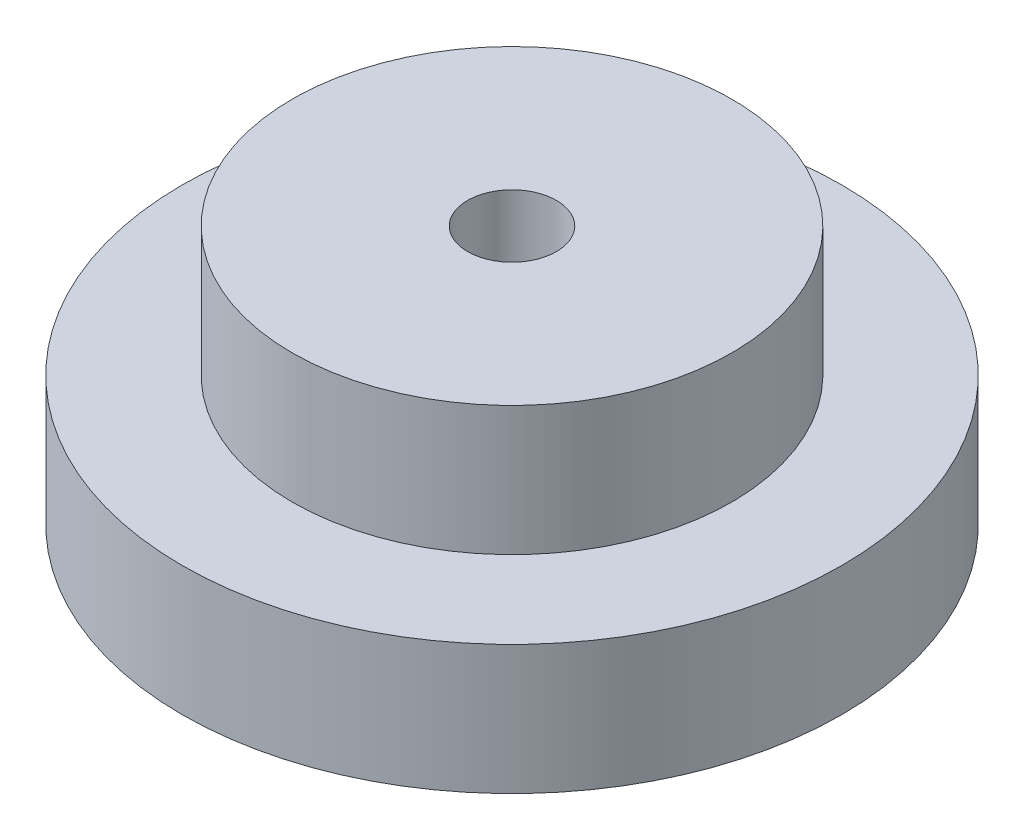
ISO-10303-21;
HEADER;
FILE_DESCRIPTION(('STEP AP214'),'2;1');
FILE_NAME('part.step','',(''),(''),'','','');
FILE_SCHEMA(('AUTOMOTIVE_DESIGN { 1 0 10303 214 1 1 1 1 }'));
ENDSEC;
DATA;
#1=APPLICATION_CONTEXT('core data for automotive mechanical design processes');
#2=APPLICATION_PROTOCOL_DEFINITION('international standard','automotive_design',2000,#1);
#3=PRODUCT_CONTEXT('',#1,'mechanical');
#4=PRODUCT('Part','Part','',(#3));
#5=PRODUCT_RELATED_PRODUCT_CATEGORY('part','',(#4));
#6=PRODUCT_DEFINITION_FORMATION('','',#4);
#7=PRODUCT_DEFINITION_CONTEXT('part definition',#1,'design');
#8=PRODUCT_DEFINITION('design','',#6,#7);
#9=PRODUCT_DEFINITION_SHAPE('','',#8);
#10=(LENGTH_UNIT() NAMED_UNIT(*) SI_UNIT(.MILLI.,.METRE.));
#11=(NAMED_UNIT(*) PLANE_ANGLE_UNIT() SI_UNIT($,.RADIAN.));
#12=(NAMED_UNIT(*) SI_UNIT($,.STERADIAN.) SOLID_ANGLE_UNIT());
#13=UNCERTAINTY_MEASURE_WITH_UNIT(LENGTH_MEASURE(1.E-05),#10,'distance_accuracy_value','');
#14=(GEOMETRIC_REPRESENTATION_CONTEXT(3) GLOBAL_UNCERTAINTY_ASSIGNED_CONTEXT((#13)) GLOBAL_UNIT_ASSIGNED_CONTEXT((#10,
#11,#12)) REPRESENTATION_CONTEXT('',''));
#15=CARTESIAN_POINT('',(0.,0.,0.));
#16=DIRECTION('',(0.,0.,1.));
#17=DIRECTION('',(1.,0.,0.));
#18=AXIS2_PLACEMENT_3D('',#15,#16,#17);
#19=CARTESIAN_POINT('',(0.,5.82,0.));
#20=DIRECTION('',(0.,1.,0.));
#21=DIRECTION('',(0.,0.,1.));
#22=AXIS2_PLACEMENT_3D('',#19,#20,#21);
#23=PLANE('',#22);
#24=CARTESIAN_POINT('',(0.,5.82,0.));
#25=DIRECTION('',(0.,1.,0.));
#26=DIRECTION('',(0.,0.,1.));
#27=AXIS2_PLACEMENT_3D('',#24,#25,#26);
#28=CIRCLE('',#27,9.9);
#29=CARTESIAN_POINT('',(0.,5.82,9.9));
#30=VERTEX_POINT('',#29);
#31=EDGE_CURVE('E10',#30,#30,#28,.T.);
#32=ORIENTED_EDGE('',*,*,#31,.F.);
#33=EDGE_LOOP('',(#32));
#34=FACE_BOUND('',#33,.T.);
#35=CARTESIAN_POINT('',(0.,5.82,0.));
#36=DIRECTION('',(0.,1.,0.));
#37=DIRECTION('',(0.,0.,1.));
#38=AXIS2_PLACEMENT_3D('',#35,#36,#37);
#39=CIRCLE('',#38,14.85);
#40=CARTESIAN_POINT('',(0.,5.82,14.85));
#41=VERTEX_POINT('',#40);
#42=EDGE_CURVE('E45',#41,#41,#39,.T.);
#43=ORIENTED_EDGE('',*,*,#42,.T.);
#44=EDGE_LOOP('',(#43));
#45=FACE_BOUND('',#44,.T.);
#46=ADVANCED_FACE('F37',(#34,#45),#23,.T.);
#47=CARTESIAN_POINT('',(0.,0.,0.));
#48=DIRECTION('',(0.,1.,0.));
#49=DIRECTION('',(0.,0.,1.));
#50=AXIS2_PLACEMENT_3D('',#47,#48,#49);
#51=PLANE('',#50);
#52=CARTESIAN_POINT('',(0.,0.,0.));
#53=DIRECTION('',(0.,1.,0.));
#54=DIRECTION('',(0.,0.,1.));
#55=AXIS2_PLACEMENT_3D('',#52,#53,#54);
#56=CIRCLE('',#55,14.85);
#57=CARTESIAN_POINT('',(0.,0.,14.85));
#58=VERTEX_POINT('',#57);
#59=EDGE_CURVE('E41',#58,#58,#56,.T.);
#60=ORIENTED_EDGE('',*,*,#59,.F.);
#61=EDGE_LOOP('',(#60));
#62=FACE_BOUND('',#61,.T.);
#63=CARTESIAN_POINT('',(0.,0.,0.));
#64=DIRECTION('',(0.,1.,0.));
#65=DIRECTION('',(0.,0.,1.));
#66=AXIS2_PLACEMENT_3D('',#63,#64,#65);
#67=CIRCLE('',#66,2.);
#68=CARTESIAN_POINT('',(0.,0.,2.));
#69=VERTEX_POINT('',#68);
#70=EDGE_CURVE('E54',#69,#69,#67,.T.);
#71=ORIENTED_EDGE('',*,*,#70,.T.);
#72=EDGE_LOOP('',(#71));
#73=FACE_BOUND('',#72,.T.);
#74=ADVANCED_FACE('F81',(#62,#73),#51,.F.);
#75=CARTESIAN_POINT('',(0.,5.82,0.));
#76=DIRECTION('',(0.,-1.,0.));
#77=DIRECTION('',(0.,0.,-1.));
#78=AXIS2_PLACEMENT_3D('',#75,#76,#77);
#79=CYLINDRICAL_SURFACE('',#78,14.85);
#80=ORIENTED_EDGE('',*,*,#42,.F.);
#81=EDGE_LOOP('',(#80));
#82=FACE_BOUND('',#81,.T.);
#83=ORIENTED_EDGE('',*,*,#59,.T.);
#84=EDGE_LOOP('',(#83));
#85=FACE_BOUND('',#84,.T.);
#86=ADVANCED_FACE('F39',(#82,#85),#79,.T.);
#87=CARTESIAN_POINT('',(0.,5.82,0.));
#88=DIRECTION('',(0.,-1.,0.));
#89=DIRECTION('',(0.,0.,-1.));
#90=AXIS2_PLACEMENT_3D('',#87,#88,#89);
#91=CYLINDRICAL_SURFACE('',#90,2.);
#92=ORIENTED_EDGE('',*,*,#70,.F.);
#93=EDGE_LOOP('',(#92));
#94=FACE_BOUND('',#93,.T.);
#95=CARTESIAN_POINT('',(0.,11.64,0.));
#96=DIRECTION('',(0.,1.,0.));
#97=DIRECTION('',(0.,0.,1.));
#98=AXIS2_PLACEMENT_3D('',#95,#96,#97);
#99=CIRCLE('',#98,2.);
#100=CARTESIAN_POINT('',(0.,11.64,2.));
#101=VERTEX_POINT('',#100);
#102=EDGE_CURVE('E60',#101,#101,#99,.T.);
#103=ORIENTED_EDGE('',*,*,#102,.T.);
#104=EDGE_LOOP('',(#103));
#105=FACE_BOUND('',#104,.T.);
#106=ADVANCED_FACE('F66',(#94,#105),#91,.F.);
#107=CARTESIAN_POINT('',(0.,11.64,0.));
#108=DIRECTION('',(0.,1.,0.));
#109=DIRECTION('',(0.,0.,1.));
#110=AXIS2_PLACEMENT_3D('',#107,#108,#109);
#111=PLANE('',#110);
#112=CARTESIAN_POINT('',(0.,11.64,0.));
#113=DIRECTION('',(0.,1.,0.));
#114=DIRECTION('',(0.,0.,1.));
#115=AXIS2_PLACEMENT_3D('',#112,#113,#114);
#116=CIRCLE('',#115,9.9);
#117=CARTESIAN_POINT('',(0.,11.64,9.9));
#118=VERTEX_POINT('',#117);
#119=EDGE_CURVE('E52',#118,#118,#116,.T.);
#120=ORIENTED_EDGE('',*,*,#119,.T.);
#121=EDGE_LOOP('',(#120));
#122=FACE_BOUND('',#121,.T.);
#123=ORIENTED_EDGE('',*,*,#102,.F.);
#124=EDGE_LOOP('',(#123));
#125=FACE_BOUND('',#124,.T.);
#126=ADVANCED_FACE('F68',(#122,#125),#111,.T.);
#127=CARTESIAN_POINT('',(0.,11.64,0.));
#128=DIRECTION('',(0.,-1.,0.));
#129=DIRECTION('',(0.,0.,-1.));
#130=AXIS2_PLACEMENT_3D('',#127,#128,#129);
#131=CYLINDRICAL_SURFACE('',#130,9.9);
#132=ORIENTED_EDGE('',*,*,#119,.F.);
#133=EDGE_LOOP('',(#132));
#134=FACE_BOUND('',#133,.T.);
#135=ORIENTED_EDGE('',*,*,#31,.T.);
#136=EDGE_LOOP('',(#135));
#137=FACE_BOUND('',#136,.T.);
#138=ADVANCED_FACE('F70',(#134,#137),#131,.T.);
#139=CLOSED_SHELL('',(#46,#74,#86,#106,#126,#138));
#140=MANIFOLD_SOLID_BREP('B2',#139);
#141=ADVANCED_BREP_SHAPE_REPRESENTATION('',(#18,#140),#14);
#142=SHAPE_DEFINITION_REPRESENTATION(#9,#141);
ENDSEC;
END-ISO-10303-21;
